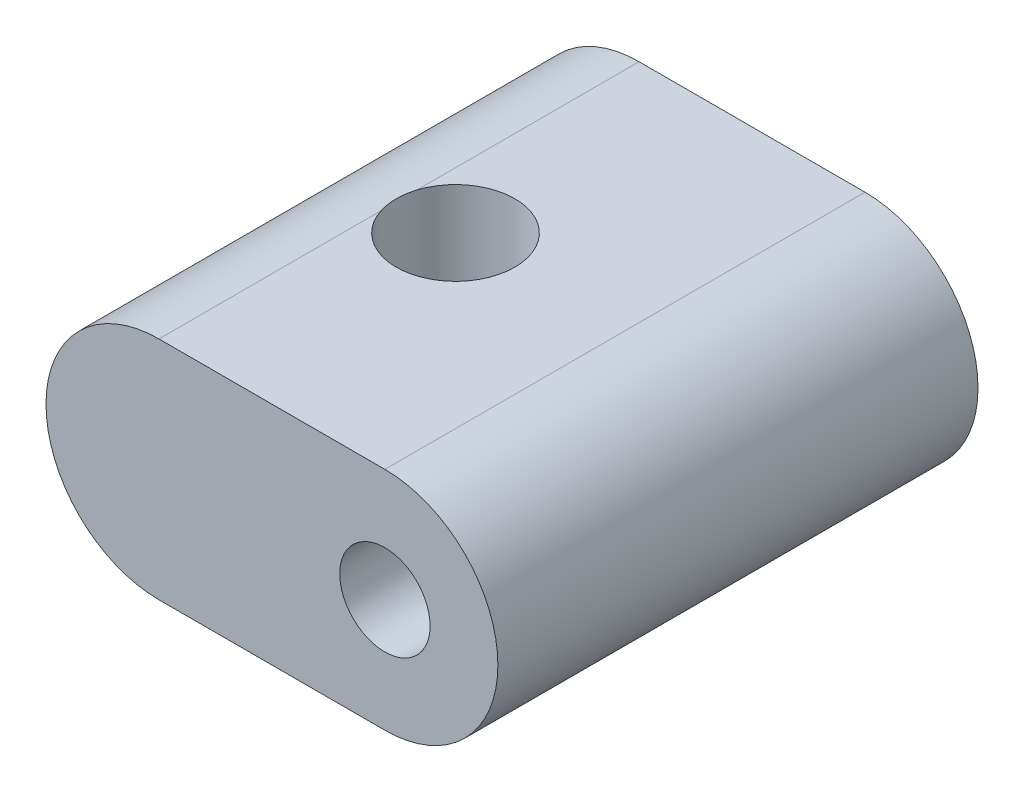
ISO-10303-21;
HEADER;
FILE_DESCRIPTION(('STEP AP214'),'2;1');
FILE_NAME('part.step','',(''),(''),'','','');
FILE_SCHEMA(('AUTOMOTIVE_DESIGN { 1 0 10303 214 1 1 1 1 }'));
ENDSEC;
DATA;
#1=APPLICATION_CONTEXT('core data for automotive mechanical design processes');
#2=APPLICATION_PROTOCOL_DEFINITION('international standard','automotive_design',2000,#1);
#3=PRODUCT_CONTEXT('',#1,'mechanical');
#4=PRODUCT('Part','Part','',(#3));
#5=PRODUCT_RELATED_PRODUCT_CATEGORY('part','',(#4));
#6=PRODUCT_DEFINITION_FORMATION('','',#4);
#7=PRODUCT_DEFINITION_CONTEXT('part definition',#1,'design');
#8=PRODUCT_DEFINITION('design','',#6,#7);
#9=PRODUCT_DEFINITION_SHAPE('','',#8);
#10=(LENGTH_UNIT() NAMED_UNIT(*) SI_UNIT(.MILLI.,.METRE.));
#11=(NAMED_UNIT(*) PLANE_ANGLE_UNIT() SI_UNIT($,.RADIAN.));
#12=(NAMED_UNIT(*) SI_UNIT($,.STERADIAN.) SOLID_ANGLE_UNIT());
#13=UNCERTAINTY_MEASURE_WITH_UNIT(LENGTH_MEASURE(1.E-05),#10,'distance_accuracy_value','');
#14=(GEOMETRIC_REPRESENTATION_CONTEXT(3) GLOBAL_UNCERTAINTY_ASSIGNED_CONTEXT((#13)) GLOBAL_UNIT_ASSIGNED_CONTEXT((#10,
#11,#12)) REPRESENTATION_CONTEXT('',''));
#15=CARTESIAN_POINT('',(0.,0.,0.));
#16=DIRECTION('',(0.,0.,1.));
#17=DIRECTION('',(1.,0.,0.));
#18=AXIS2_PLACEMENT_3D('',#15,#16,#17);
#19=CARTESIAN_POINT('',(-8.,0.,22.));
#20=DIRECTION('',(0.,0.,1.));
#21=DIRECTION('',(1.,0.,0.));
#22=AXIS2_PLACEMENT_3D('',#19,#20,#21);
#23=PLANE('',#22);
#24=CARTESIAN_POINT('',(-8.,0.,22.));
#25=DIRECTION('',(0.,0.,1.));
#26=DIRECTION('',(1.,0.,0.));
#27=AXIS2_PLACEMENT_3D('',#24,#25,#26);
#28=CIRCLE('',#27,4.);
#29=CARTESIAN_POINT('',(-8.,4.,22.));
#30=VERTEX_POINT('',#29);
#31=CARTESIAN_POINT('',(-8.,-4.,22.));
#32=VERTEX_POINT('',#31);
#33=EDGE_CURVE('E159',#30,#32,#28,.T.);
#34=ORIENTED_EDGE('',*,*,#33,.T.);
#35=DIRECTION('',(1.,0.,0.));
#36=VECTOR('',#35,1.);
#37=CARTESIAN_POINT('',(-8.,-4.,22.));
#38=LINE('',#37,#36);
#39=CARTESIAN_POINT('',(0.,-4.,22.));
#40=VERTEX_POINT('',#39);
#41=EDGE_CURVE('E111',#32,#40,#38,.T.);
#42=ORIENTED_EDGE('',*,*,#41,.T.);
#43=CARTESIAN_POINT('',(0.,0.,22.));
#44=DIRECTION('',(0.,0.,1.));
#45=DIRECTION('',(1.,0.,0.));
#46=AXIS2_PLACEMENT_3D('',#43,#44,#45);
#47=CIRCLE('',#46,4.);
#48=CARTESIAN_POINT('',(0.,4.,22.));
#49=VERTEX_POINT('',#48);
#50=EDGE_CURVE('E144',#40,#49,#47,.T.);
#51=ORIENTED_EDGE('',*,*,#50,.T.);
#52=DIRECTION('',(-1.,0.,0.));
#53=VECTOR('',#52,1.);
#54=CARTESIAN_POINT('',(-8.,4.,22.));
#55=LINE('',#54,#53);
#56=EDGE_CURVE('E141',#49,#30,#55,.T.);
#57=ORIENTED_EDGE('',*,*,#56,.T.);
#58=EDGE_LOOP('',(#34,#42,#51,#57));
#59=FACE_BOUND('',#58,.T.);
#60=CARTESIAN_POINT('',(0.,0.,22.));
#61=DIRECTION('',(0.,0.,1.));
#62=DIRECTION('',(1.,0.,0.));
#63=AXIS2_PLACEMENT_3D('',#60,#61,#62);
#64=CIRCLE('',#63,1.6);
#65=CARTESIAN_POINT('',(1.6,0.,22.));
#66=VERTEX_POINT('',#65);
#67=EDGE_CURVE('E154',#66,#66,#64,.T.);
#68=ORIENTED_EDGE('',*,*,#67,.F.);
#69=EDGE_LOOP('',(#68));
#70=FACE_BOUND('',#69,.T.);
#71=ADVANCED_FACE('F39',(#59,#70),#23,.T.);
#72=CARTESIAN_POINT('',(-8.,0.,5.));
#73=DIRECTION('',(0.,0.,1.));
#74=DIRECTION('',(1.,0.,0.));
#75=AXIS2_PLACEMENT_3D('',#72,#73,#74);
#76=PLANE('',#75);
#77=CARTESIAN_POINT('',(-8.,0.,5.));
#78=DIRECTION('',(0.,0.,1.));
#79=DIRECTION('',(1.,0.,0.));
#80=AXIS2_PLACEMENT_3D('',#77,#78,#79);
#81=CIRCLE('',#80,4.);
#82=CARTESIAN_POINT('',(-8.,4.,5.));
#83=VERTEX_POINT('',#82);
#84=CARTESIAN_POINT('',(-8.,-4.,5.));
#85=VERTEX_POINT('',#84);
#86=EDGE_CURVE('E151',#83,#85,#81,.T.);
#87=ORIENTED_EDGE('',*,*,#86,.F.);
#88=DIRECTION('',(-1.,0.,0.));
#89=VECTOR('',#88,1.);
#90=CARTESIAN_POINT('',(-8.,4.,5.));
#91=LINE('',#90,#89);
#92=CARTESIAN_POINT('',(0.,4.,5.));
#93=VERTEX_POINT('',#92);
#94=EDGE_CURVE('E128',#93,#83,#91,.T.);
#95=ORIENTED_EDGE('',*,*,#94,.F.);
#96=CARTESIAN_POINT('',(0.,0.,5.));
#97=DIRECTION('',(0.,0.,1.));
#98=DIRECTION('',(1.,0.,0.));
#99=AXIS2_PLACEMENT_3D('',#96,#97,#98);
#100=CIRCLE('',#99,4.);
#101=CARTESIAN_POINT('',(0.,-4.,5.));
#102=VERTEX_POINT('',#101);
#103=EDGE_CURVE('E155',#102,#93,#100,.T.);
#104=ORIENTED_EDGE('',*,*,#103,.F.);
#105=DIRECTION('',(1.,0.,0.));
#106=VECTOR('',#105,1.);
#107=CARTESIAN_POINT('',(-8.,-4.,5.));
#108=LINE('',#107,#106);
#109=EDGE_CURVE('E153',#85,#102,#108,.T.);
#110=ORIENTED_EDGE('',*,*,#109,.F.);
#111=EDGE_LOOP('',(#87,#95,#104,#110));
#112=FACE_BOUND('',#111,.T.);
#113=CARTESIAN_POINT('',(0.,0.,5.));
#114=DIRECTION('',(0.,0.,1.));
#115=DIRECTION('',(1.,0.,0.));
#116=AXIS2_PLACEMENT_3D('',#113,#114,#115);
#117=CIRCLE('',#116,1.6);
#118=CARTESIAN_POINT('',(1.6,0.,5.));
#119=VERTEX_POINT('',#118);
#120=EDGE_CURVE('E165',#119,#119,#117,.T.);
#121=ORIENTED_EDGE('',*,*,#120,.T.);
#122=EDGE_LOOP('',(#121));
#123=FACE_BOUND('',#122,.T.);
#124=ADVANCED_FACE('F199',(#112,#123),#76,.F.);
#125=CARTESIAN_POINT('',(-8.,0.,22.));
#126=DIRECTION('',(0.,0.,-1.));
#127=DIRECTION('',(-1.,0.,0.));
#128=AXIS2_PLACEMENT_3D('',#125,#126,#127);
#129=CYLINDRICAL_SURFACE('',#128,4.);
#130=DIRECTION('',(0.,0.,-1.));
#131=VECTOR('',#130,1.);
#132=CARTESIAN_POINT('',(-8.,4.,22.));
#133=LINE('',#132,#131);
#134=CARTESIAN_POINT('',(-8.,4.,14.1403124237433));
#135=VERTEX_POINT('',#134);
#136=EDGE_CURVE('E125',#30,#135,#133,.T.);
#137=ORIENTED_EDGE('',*,*,#136,.T.);
#138=CARTESIAN_POINT('',(-8.,4.,12.8596875762567));
#139=CARTESIAN_POINT('',(-8.00741562703866,3.9999921657218,12.8828497854494));
#140=CARTESIAN_POINT('',(-8.01442833513016,3.99996301005138,12.906139779348));
#141=CARTESIAN_POINT('',(-8.02554725224975,3.99989406738648,12.9455324450432));
#142=CARTESIAN_POINT('',(-8.02987031926615,3.99986057660324,12.9615740836556));
#143=CARTESIAN_POINT('',(-8.03887298400494,3.99978221714506,12.9966309521956));
#144=CARTESIAN_POINT('',(-8.0434782518181,3.99973638472042,13.0156653163173));
#145=CARTESIAN_POINT('',(-8.05281227533855,3.99963270224672,13.0567503333732));
#146=CARTESIAN_POINT('',(-8.05745391410916,3.99957408366761,13.0788208040772));
#147=CARTESIAN_POINT('',(-8.06658800509691,3.99944346287935,13.1260143951836));
#148=CARTESIAN_POINT('',(-8.07098038764377,3.99937071464885,13.1511569145239));
#149=CARTESIAN_POINT('',(-8.07920085204966,3.99921964446156,13.2038617073733));
#150=CARTESIAN_POINT('',(-8.08294221532351,3.99914141209404,13.231437554109));
#151=CARTESIAN_POINT('',(-8.08888105118851,3.99900558886647,13.2828612261249));
#152=CARTESIAN_POINT('',(-8.09122106115634,3.9989466408726,13.3066926955125));
#153=CARTESIAN_POINT('',(-8.09477170225667,3.99884955338541,13.3505542772213));
#154=CARTESIAN_POINT('',(-8.09610389947227,3.99880958986369,13.3705745868147));
#155=CARTESIAN_POINT('',(-8.09799191355657,3.99874648670646,13.4067701554152));
#156=CARTESIAN_POINT('',(-8.09864805180042,3.99872158811807,13.422940241223));
#157=CARTESIAN_POINT('',(-8.099718067657,3.99869730686593,13.4598310805944));
#158=CARTESIAN_POINT('',(-8.1000122718694,3.99870704653784,13.4805553322887));
#159=CARTESIAN_POINT('',(-8.09997756876981,3.99882426065574,13.5373561719447));
#160=CARTESIAN_POINT('',(-8.09902570468827,3.99899878425209,13.5734340547053));
#161=CARTESIAN_POINT('',(-8.09526464936389,3.99926484656454,13.6454915625817));
#162=CARTESIAN_POINT('',(-8.09245546194611,3.99935638545156,13.6814711878998));
#163=CARTESIAN_POINT('',(-8.08498725677712,3.99953233830148,13.7532382918526));
#164=CARTESIAN_POINT('',(-8.08032824207363,3.99961675227611,13.7890257708037));
#165=CARTESIAN_POINT('',(-8.06917281376922,3.99975815482914,13.8603131141854));
#166=CARTESIAN_POINT('',(-8.06267640243872,3.99981514344143,13.8958129789714));
#167=CARTESIAN_POINT('',(-8.04786316759908,3.99990703749522,13.966430863079));
#168=CARTESIAN_POINT('',(-8.03954634558957,3.99994194295492,14.0015488827152));
#169=CARTESIAN_POINT('',(-8.02111538566985,3.9999886022791,14.071310056887));
#170=CARTESIAN_POINT('',(-8.01100124849993,4.00000035615312,14.1059532116183));
#171=CARTESIAN_POINT('',(-8.,4.,14.1403124237433));
#172=B_SPLINE_CURVE_WITH_KNOTS('',3,(#138,#139,#140,#141,#142,#143,#144,#145,#146,#147,#148,
#149,#150,#151,#152,#153,#154,#155,#156,#157,#158,#159,#160,#161,#162,#163,#164,#165,#166,#167,
#168,#169,#170,#171),.UNSPECIFIED.,.F.,.F.,(4,2,2,2,2,2,2,2,2,2,2,2,2,2,2,2,4),(0.,
0.0729548001045042,0.122792307595716,0.181535377820162,0.249183752463285,0.325737131132028,
0.40920025419918,0.481024861206613,0.541210410983863,0.589756459339259,0.651927163240529,
0.760148112442788,0.868368838769743,0.976589386796243,1.08480980109735,1.19303012624831,
1.30125040682446),.UNSPECIFIED.);
#173=CARTESIAN_POINT('',(-8.,4.,12.8596875762567));
#174=VERTEX_POINT('',#173);
#175=EDGE_CURVE('E65',#174,#135,#172,.T.);
#176=ORIENTED_EDGE('',*,*,#175,.F.);
#177=EDGE_CURVE('E44',#174,#83,#133,.T.);
#178=ORIENTED_EDGE('',*,*,#177,.T.);
#179=ORIENTED_EDGE('',*,*,#86,.T.);
#180=DIRECTION('',(0.,0.,-1.));
#181=VECTOR('',#180,1.);
#182=CARTESIAN_POINT('',(-8.,-4.,22.));
#183=LINE('',#182,#181);
#184=CARTESIAN_POINT('',(-8.,-4.,12.8596875762567));
#185=VERTEX_POINT('',#184);
#186=EDGE_CURVE('E106',#185,#85,#183,.T.);
#187=ORIENTED_EDGE('',*,*,#186,.F.);
#188=CARTESIAN_POINT('',(-8.,-4.,12.8596875762567));
#189=CARTESIAN_POINT('',(-8.00829575164341,-3.99999968257141,12.8855955704702));
#190=CARTESIAN_POINT('',(-8.01609828457577,-3.99997417740281,12.9116620252913));
#191=CARTESIAN_POINT('',(-8.03066094583814,-3.99988916951017,12.9639577974876));
#192=CARTESIAN_POINT('',(-8.03742561335221,-3.99982982051569,12.9901858515322));
#193=CARTESIAN_POINT('',(-8.04991274434441,-3.99969341606742,13.0428048766296));
#194=CARTESIAN_POINT('',(-8.05563831159851,-3.99961641495351,13.0691951106721));
#195=CARTESIAN_POINT('',(-8.06604908851692,-3.99945804254131,13.1221377993891));
#196=CARTESIAN_POINT('',(-8.07073588683612,-3.9993766781561,13.1486899416371));
#197=CARTESIAN_POINT('',(-8.07907071234149,-3.99922057279004,13.2019560870034));
#198=CARTESIAN_POINT('',(-8.08271876650298,-3.99914583163721,13.2286700859));
#199=CARTESIAN_POINT('',(-8.08897784388351,-3.99901147326897,13.2822596370932));
#200=CARTESIAN_POINT('',(-8.09158731312125,-3.99895187876449,13.3091353708517));
#201=CARTESIAN_POINT('',(-8.09577093491875,-3.99885387574924,13.3630482525003));
#202=CARTESIAN_POINT('',(-8.0973419621375,-3.99881553124887,13.3900856427501));
#203=CARTESIAN_POINT('',(-8.09945032473285,-3.99876365221776,13.4443217191159));
#204=CARTESIAN_POINT('',(-8.09998300089568,-3.99875022952709,13.4715205854374));
#205=CARTESIAN_POINT('',(-8.10001628481948,-3.9987493975893,13.5260273429509));
#206=CARTESIAN_POINT('',(-8.09951277196903,-3.99876209220277,13.5533352367493));
#207=CARTESIAN_POINT('',(-8.09745436910311,-3.99881278680485,13.6077887179402));
#208=CARTESIAN_POINT('',(-8.0959042123021,-3.99885067285909,13.6349344833716));
#209=CARTESIAN_POINT('',(-8.09175392281959,-3.99894805081249,13.689063474635));
#210=CARTESIAN_POINT('',(-8.08915696572422,-3.99900747731183,13.7160469437669));
#211=CARTESIAN_POINT('',(-8.08291454527653,-3.99914177080457,13.7698513183511));
#212=CARTESIAN_POINT('',(-8.0792706610267,-3.99921661449612,13.7966724069748));
#213=CARTESIAN_POINT('',(-8.07093582682896,-3.99937313689171,13.8501520849054));
#214=CARTESIAN_POINT('',(-8.06624484956957,-3.99945481577401,13.876810669955));
#215=CARTESIAN_POINT('',(-8.05581739224898,-3.99961393058718,13.9299656001205));
#216=CARTESIAN_POINT('',(-8.05007929804515,-3.99969135972394,13.9564616285566));
#217=CARTESIAN_POINT('',(-8.03755880915518,-3.99982859859577,14.0092915999731));
#218=CARTESIAN_POINT('',(-8.03077326102272,-3.99988835348218,14.035624795138));
#219=CARTESIAN_POINT('',(-8.01616057501894,-3.99997397094718,14.0881302255188));
#220=CARTESIAN_POINT('',(-8.00832882586446,-3.99999967763837,14.1143011780775));
#221=CARTESIAN_POINT('',(-8.,-4.,14.1403124237433));
#222=B_SPLINE_CURVE_WITH_KNOTS('',3,(#188,#189,#190,#191,#192,#193,#194,#195,#196,#197,#198,
#199,#200,#201,#202,#203,#204,#205,#206,#207,#208,#209,#210,#211,#212,#213,#214,#215,#216,#217,
#218,#219,#220,#221),.UNSPECIFIED.,.F.,.F.,(4,2,2,2,2,2,2,2,2,2,2,2,2,2,2,2,4),(0.,
0.0816070429718306,0.162846319960241,0.243838792492804,0.324706530047574,0.405572167343884,
0.486558348933125,0.56778717356961,0.64937965085311,0.731297223755556,0.812846802104003,
0.894150830449326,0.975332864270165,1.05651701582071,1.13782738736075,1.21938750461108,
1.30131976326532),.UNSPECIFIED.);
#223=CARTESIAN_POINT('',(-8.,-4.,14.1403124237433));
#224=VERTEX_POINT('',#223);
#225=EDGE_CURVE('E57',#185,#224,#222,.T.);
#226=ORIENTED_EDGE('',*,*,#225,.T.);
#227=EDGE_CURVE('E50',#32,#224,#183,.T.);
#228=ORIENTED_EDGE('',*,*,#227,.F.);
#229=ORIENTED_EDGE('',*,*,#33,.F.);
#230=EDGE_LOOP('',(#137,#176,#178,#179,#187,#226,#228,#229));
#231=FACE_BOUND('',#230,.T.);
#232=ADVANCED_FACE('F41',(#231),#129,.T.);
#233=CARTESIAN_POINT('',(-8.,-4.,22.));
#234=DIRECTION('',(0.,1.,0.));
#235=DIRECTION('',(-1.,0.,0.));
#236=AXIS2_PLACEMENT_3D('',#233,#234,#235);
#237=PLANE('',#236);
#238=ORIENTED_EDGE('',*,*,#227,.T.);
#239=CARTESIAN_POINT('',(-6.,-4.,13.5));
#240=DIRECTION('',(0.,1.,0.));
#241=DIRECTION('',(0.,0.,1.));
#242=AXIS2_PLACEMENT_3D('',#239,#240,#241);
#243=CIRCLE('',#242,2.1);
#244=EDGE_CURVE('E94',#224,#185,#243,.T.);
#245=ORIENTED_EDGE('',*,*,#244,.T.);
#246=ORIENTED_EDGE('',*,*,#186,.T.);
#247=ORIENTED_EDGE('',*,*,#109,.T.);
#248=DIRECTION('',(0.,0.,-1.));
#249=VECTOR('',#248,1.);
#250=CARTESIAN_POINT('',(0.,-4.,22.));
#251=LINE('',#250,#249);
#252=EDGE_CURVE('E114',#40,#102,#251,.T.);
#253=ORIENTED_EDGE('',*,*,#252,.F.);
#254=ORIENTED_EDGE('',*,*,#41,.F.);
#255=EDGE_LOOP('',(#238,#245,#246,#247,#253,#254));
#256=FACE_BOUND('',#255,.T.);
#257=ADVANCED_FACE('F109',(#256),#237,.F.);
#258=CARTESIAN_POINT('',(0.,0.,22.));
#259=DIRECTION('',(0.,0.,-1.));
#260=DIRECTION('',(-1.,0.,0.));
#261=AXIS2_PLACEMENT_3D('',#258,#259,#260);
#262=CYLINDRICAL_SURFACE('',#261,4.);
#263=ORIENTED_EDGE('',*,*,#103,.T.);
#264=DIRECTION('',(0.,0.,-1.));
#265=VECTOR('',#264,1.);
#266=CARTESIAN_POINT('',(0.,4.,22.));
#267=LINE('',#266,#265);
#268=EDGE_CURVE('E123',#49,#93,#267,.T.);
#269=ORIENTED_EDGE('',*,*,#268,.F.);
#270=ORIENTED_EDGE('',*,*,#50,.F.);
#271=ORIENTED_EDGE('',*,*,#252,.T.);
#272=EDGE_LOOP('',(#263,#269,#270,#271));
#273=FACE_BOUND('',#272,.T.);
#274=ADVANCED_FACE('F205',(#273),#262,.T.);
#275=CARTESIAN_POINT('',(-8.,4.,22.));
#276=DIRECTION('',(0.,-1.,0.));
#277=DIRECTION('',(1.,0.,0.));
#278=AXIS2_PLACEMENT_3D('',#275,#276,#277);
#279=PLANE('',#278);
#280=ORIENTED_EDGE('',*,*,#177,.F.);
#281=CARTESIAN_POINT('',(-6.,4.,13.5));
#282=DIRECTION('',(0.,-1.,0.));
#283=DIRECTION('',(1.,0.,0.));
#284=AXIS2_PLACEMENT_3D('',#281,#282,#283);
#285=CIRCLE('',#284,2.1);
#286=EDGE_CURVE('E11',#174,#135,#285,.T.);
#287=ORIENTED_EDGE('',*,*,#286,.T.);
#288=ORIENTED_EDGE('',*,*,#136,.F.);
#289=ORIENTED_EDGE('',*,*,#56,.F.);
#290=ORIENTED_EDGE('',*,*,#268,.T.);
#291=ORIENTED_EDGE('',*,*,#94,.T.);
#292=EDGE_LOOP('',(#280,#287,#288,#289,#290,#291));
#293=FACE_BOUND('',#292,.T.);
#294=ADVANCED_FACE('F195',(#293),#279,.F.);
#295=CARTESIAN_POINT('',(0.,0.,22.));
#296=DIRECTION('',(0.,0.,-1.));
#297=DIRECTION('',(-1.,0.,0.));
#298=AXIS2_PLACEMENT_3D('',#295,#296,#297);
#299=CYLINDRICAL_SURFACE('',#298,1.6);
#300=ORIENTED_EDGE('',*,*,#67,.T.);
#301=EDGE_LOOP('',(#300));
#302=FACE_BOUND('',#301,.T.);
#303=ORIENTED_EDGE('',*,*,#120,.F.);
#304=EDGE_LOOP('',(#303));
#305=FACE_BOUND('',#304,.T.);
#306=ADVANCED_FACE('F181',(#302,#305),#299,.F.);
#307=CARTESIAN_POINT('',(-6.,-4.,13.5));
#308=DIRECTION('',(0.,1.,0.));
#309=DIRECTION('',(0.,0.,1.));
#310=AXIS2_PLACEMENT_3D('',#307,#308,#309);
#311=CYLINDRICAL_SURFACE('',#310,2.1);
#312=ORIENTED_EDGE('',*,*,#244,.F.);
#313=ORIENTED_EDGE('',*,*,#225,.F.);
#314=EDGE_LOOP('',(#312,#313));
#315=FACE_BOUND('',#314,.T.);
#316=ORIENTED_EDGE('',*,*,#286,.F.);
#317=ORIENTED_EDGE('',*,*,#175,.T.);
#318=EDGE_LOOP('',(#316,#317));
#319=FACE_BOUND('',#318,.T.);
#320=ADVANCED_FACE('F95',(#315,#319),#311,.F.);
#321=CLOSED_SHELL('',(#71,#124,#232,#257,#274,#294,#306,#320));
#322=MANIFOLD_SOLID_BREP('B2',#321);
#323=ADVANCED_BREP_SHAPE_REPRESENTATION('',(#18,#322),#14);
#324=SHAPE_DEFINITION_REPRESENTATION(#9,#323);
ENDSEC;
END-ISO-10303-21;
